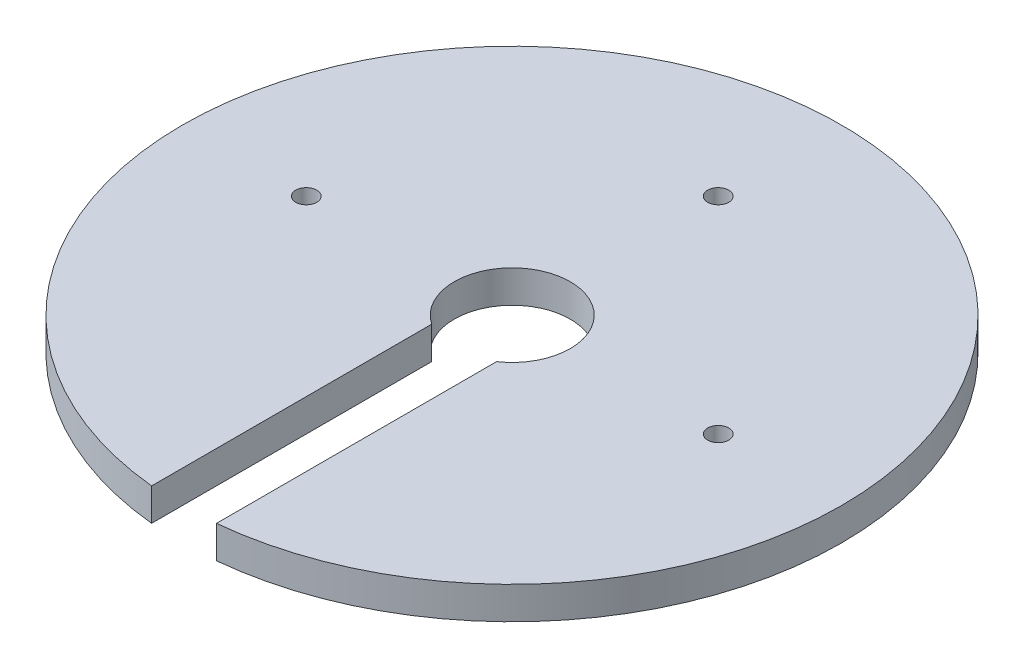
ISO-10303-21;
HEADER;
FILE_DESCRIPTION(('STEP AP214'),'2;1');
FILE_NAME('part.step','',(''),(''),'','','');
FILE_SCHEMA(('AUTOMOTIVE_DESIGN { 1 0 10303 214 1 1 1 1 }'));
ENDSEC;
DATA;
#1=APPLICATION_CONTEXT('core data for automotive mechanical design processes');
#2=APPLICATION_PROTOCOL_DEFINITION('international standard','automotive_design',2000,#1);
#3=PRODUCT_CONTEXT('',#1,'mechanical');
#4=PRODUCT('Part','Part','',(#3));
#5=PRODUCT_RELATED_PRODUCT_CATEGORY('part','',(#4));
#6=PRODUCT_DEFINITION_FORMATION('','',#4);
#7=PRODUCT_DEFINITION_CONTEXT('part definition',#1,'design');
#8=PRODUCT_DEFINITION('design','',#6,#7);
#9=PRODUCT_DEFINITION_SHAPE('','',#8);
#10=(LENGTH_UNIT() NAMED_UNIT(*) SI_UNIT(.MILLI.,.METRE.));
#11=(NAMED_UNIT(*) PLANE_ANGLE_UNIT() SI_UNIT($,.RADIAN.));
#12=(NAMED_UNIT(*) SI_UNIT($,.STERADIAN.) SOLID_ANGLE_UNIT());
#13=UNCERTAINTY_MEASURE_WITH_UNIT(LENGTH_MEASURE(1.E-05),#10,'distance_accuracy_value','');
#14=(GEOMETRIC_REPRESENTATION_CONTEXT(3) GLOBAL_UNCERTAINTY_ASSIGNED_CONTEXT((#13)) GLOBAL_UNIT_ASSIGNED_CONTEXT((#10,
#11,#12)) REPRESENTATION_CONTEXT('',''));
#15=CARTESIAN_POINT('',(0.,0.,0.));
#16=DIRECTION('',(0.,0.,1.));
#17=DIRECTION('',(1.,0.,0.));
#18=AXIS2_PLACEMENT_3D('',#15,#16,#17);
#19=CARTESIAN_POINT('',(0.,10.,0.));
#20=DIRECTION('',(0.,-1.,0.));
#21=DIRECTION('',(0.,0.,-1.));
#22=AXIS2_PLACEMENT_3D('',#19,#20,#21);
#23=CYLINDRICAL_SURFACE('',#22,101.6);
#24=CARTESIAN_POINT('',(0.,10.,0.));
#25=DIRECTION('',(0.,1.,0.));
#26=DIRECTION('',(0.,0.,1.));
#27=AXIS2_PLACEMENT_3D('',#24,#25,#26);
#28=CIRCLE('',#27,101.6);
#29=CARTESIAN_POINT('',(9.99999999999999,10.,101.106676337421));
#30=VERTEX_POINT('',#29);
#31=CARTESIAN_POINT('',(-9.99999999999999,10.,101.106676337421));
#32=VERTEX_POINT('',#31);
#33=EDGE_CURVE('E11',#30,#32,#28,.T.);
#34=ORIENTED_EDGE('',*,*,#33,.F.);
#35=DIRECTION('',(0.,1.,0.));
#36=VECTOR('',#35,1.);
#37=CARTESIAN_POINT('',(9.99999999999999,0.,101.106676337421));
#38=LINE('',#37,#36);
#39=CARTESIAN_POINT('',(9.99999999999999,0.,101.106676337421));
#40=VERTEX_POINT('',#39);
#41=EDGE_CURVE('E107',#40,#30,#38,.T.);
#42=ORIENTED_EDGE('',*,*,#41,.F.);
#43=CARTESIAN_POINT('',(0.,0.,0.));
#44=DIRECTION('',(0.,1.,0.));
#45=DIRECTION('',(0.,0.,1.));
#46=AXIS2_PLACEMENT_3D('',#43,#44,#45);
#47=CIRCLE('',#46,101.6);
#48=CARTESIAN_POINT('',(-9.99999999999999,0.,101.106676337421));
#49=VERTEX_POINT('',#48);
#50=EDGE_CURVE('E40',#40,#49,#47,.T.);
#51=ORIENTED_EDGE('',*,*,#50,.T.);
#52=DIRECTION('',(0.,1.,0.));
#53=VECTOR('',#52,1.);
#54=CARTESIAN_POINT('',(-9.99999999999999,0.,101.106676337421));
#55=LINE('',#54,#53);
#56=EDGE_CURVE('E51',#49,#32,#55,.T.);
#57=ORIENTED_EDGE('',*,*,#56,.T.);
#58=EDGE_LOOP('',(#34,#42,#51,#57));
#59=FACE_BOUND('',#58,.T.);
#60=ADVANCED_FACE('F37',(#59),#23,.T.);
#61=CARTESIAN_POINT('',(0.,10.,0.));
#62=DIRECTION('',(0.,1.,0.));
#63=DIRECTION('',(0.,0.,1.));
#64=AXIS2_PLACEMENT_3D('',#61,#62,#63);
#65=PLANE('',#64);
#66=CARTESIAN_POINT('',(0.,10.,-63.5707950450435));
#67=DIRECTION('',(0.,1.,0.));
#68=DIRECTION('',(0.,0.,1.));
#69=AXIS2_PLACEMENT_3D('',#66,#67,#68);
#70=CIRCLE('',#69,3.25);
#71=CARTESIAN_POINT('',(0.,10.,-60.3207950450435));
#72=VERTEX_POINT('',#71);
#73=EDGE_CURVE('E139',#72,#72,#70,.T.);
#74=ORIENTED_EDGE('',*,*,#73,.F.);
#75=EDGE_LOOP('',(#74));
#76=FACE_BOUND('',#75,.T.);
#77=CARTESIAN_POINT('',(-63.5,10.,-0.0707950450435403));
#78=DIRECTION('',(0.,1.,0.));
#79=DIRECTION('',(0.,0.,1.));
#80=AXIS2_PLACEMENT_3D('',#77,#78,#79);
#81=CIRCLE('',#80,3.25000000000001);
#82=CARTESIAN_POINT('',(-63.5,10.,3.17920495495647));
#83=VERTEX_POINT('',#82);
#84=EDGE_CURVE('E143',#83,#83,#81,.T.);
#85=ORIENTED_EDGE('',*,*,#84,.F.);
#86=EDGE_LOOP('',(#85));
#87=FACE_BOUND('',#86,.T.);
#88=CARTESIAN_POINT('',(63.5,10.,-0.0707950450435403));
#89=DIRECTION('',(0.,1.,0.));
#90=DIRECTION('',(0.,0.,1.));
#91=AXIS2_PLACEMENT_3D('',#88,#89,#90);
#92=CIRCLE('',#91,3.25000000000001);
#93=CARTESIAN_POINT('',(63.5,10.,3.17920495495647));
#94=VERTEX_POINT('',#93);
#95=EDGE_CURVE('E104',#94,#94,#92,.T.);
#96=ORIENTED_EDGE('',*,*,#95,.F.);
#97=EDGE_LOOP('',(#96));
#98=FACE_BOUND('',#97,.T.);
#99=DIRECTION('',(0.,0.,-1.));
#100=VECTOR('',#99,1.);
#101=CARTESIAN_POINT('',(10.,10.,14.746676337421));
#102=LINE('',#101,#100);
#103=CARTESIAN_POINT('',(10.,10.,14.746676337421));
#104=VERTEX_POINT('',#103);
#105=EDGE_CURVE('E94',#30,#104,#102,.T.);
#106=ORIENTED_EDGE('',*,*,#105,.F.);
#107=ORIENTED_EDGE('',*,*,#33,.T.);
#108=DIRECTION('',(0.,0.,1.));
#109=VECTOR('',#108,1.);
#110=CARTESIAN_POINT('',(-10.,10.,14.746676337421));
#111=LINE('',#110,#109);
#112=CARTESIAN_POINT('',(-10.,10.,14.746676337421));
#113=VERTEX_POINT('',#112);
#114=EDGE_CURVE('E96',#113,#32,#111,.T.);
#115=ORIENTED_EDGE('',*,*,#114,.F.);
#116=CARTESIAN_POINT('',(0.,10.,-0.0707950450435403));
#117=DIRECTION('',(0.,1.,0.));
#118=DIRECTION('',(0.,0.,-1.));
#119=AXIS2_PLACEMENT_3D('',#116,#117,#118);
#120=CIRCLE('',#119,17.8761701203069);
#121=EDGE_CURVE('E83',#104,#113,#120,.T.);
#122=ORIENTED_EDGE('',*,*,#121,.F.);
#123=EDGE_LOOP('',(#106,#107,#115,#122));
#124=FACE_BOUND('',#123,.T.);
#125=ADVANCED_FACE('F114',(#76,#87,#98,#124),#65,.T.);
#126=CARTESIAN_POINT('',(0.,0.,0.));
#127=DIRECTION('',(0.,1.,0.));
#128=DIRECTION('',(0.,0.,1.));
#129=AXIS2_PLACEMENT_3D('',#126,#127,#128);
#130=PLANE('',#129);
#131=CARTESIAN_POINT('',(0.,0.,-63.5707950450435));
#132=DIRECTION('',(0.,1.,0.));
#133=DIRECTION('',(0.,0.,1.));
#134=AXIS2_PLACEMENT_3D('',#131,#132,#133);
#135=CIRCLE('',#134,3.25);
#136=CARTESIAN_POINT('',(0.,0.,-60.3207950450435));
#137=VERTEX_POINT('',#136);
#138=EDGE_CURVE('E99',#137,#137,#135,.T.);
#139=ORIENTED_EDGE('',*,*,#138,.T.);
#140=EDGE_LOOP('',(#139));
#141=FACE_BOUND('',#140,.T.);
#142=CARTESIAN_POINT('',(-63.5,0.,-0.0707950450435403));
#143=DIRECTION('',(0.,1.,0.));
#144=DIRECTION('',(0.,0.,1.));
#145=AXIS2_PLACEMENT_3D('',#142,#143,#144);
#146=CIRCLE('',#145,3.25000000000001);
#147=CARTESIAN_POINT('',(-63.5,0.,3.17920495495647));
#148=VERTEX_POINT('',#147);
#149=EDGE_CURVE('E153',#148,#148,#146,.T.);
#150=ORIENTED_EDGE('',*,*,#149,.T.);
#151=EDGE_LOOP('',(#150));
#152=FACE_BOUND('',#151,.T.);
#153=CARTESIAN_POINT('',(63.5,0.,-0.0707950450435403));
#154=DIRECTION('',(0.,1.,0.));
#155=DIRECTION('',(0.,0.,1.));
#156=AXIS2_PLACEMENT_3D('',#153,#154,#155);
#157=CIRCLE('',#156,3.25000000000001);
#158=CARTESIAN_POINT('',(63.5,0.,3.17920495495647));
#159=VERTEX_POINT('',#158);
#160=EDGE_CURVE('E147',#159,#159,#157,.T.);
#161=ORIENTED_EDGE('',*,*,#160,.T.);
#162=EDGE_LOOP('',(#161));
#163=FACE_BOUND('',#162,.T.);
#164=ORIENTED_EDGE('',*,*,#50,.F.);
#165=DIRECTION('',(0.,0.,-1.));
#166=VECTOR('',#165,1.);
#167=CARTESIAN_POINT('',(10.,0.,14.746676337421));
#168=LINE('',#167,#166);
#169=CARTESIAN_POINT('',(10.,0.,14.746676337421));
#170=VERTEX_POINT('',#169);
#171=EDGE_CURVE('E85',#40,#170,#168,.T.);
#172=ORIENTED_EDGE('',*,*,#171,.T.);
#173=CARTESIAN_POINT('',(0.,0.,-0.0707950450435403));
#174=DIRECTION('',(0.,1.,0.));
#175=DIRECTION('',(0.,0.,-1.));
#176=AXIS2_PLACEMENT_3D('',#173,#174,#175);
#177=CIRCLE('',#176,17.8761701203069);
#178=CARTESIAN_POINT('',(-10.,0.,14.746676337421));
#179=VERTEX_POINT('',#178);
#180=EDGE_CURVE('E80',#170,#179,#177,.T.);
#181=ORIENTED_EDGE('',*,*,#180,.T.);
#182=DIRECTION('',(0.,0.,1.));
#183=VECTOR('',#182,1.);
#184=CARTESIAN_POINT('',(-10.,0.,14.746676337421));
#185=LINE('',#184,#183);
#186=EDGE_CURVE('E87',#179,#49,#185,.T.);
#187=ORIENTED_EDGE('',*,*,#186,.T.);
#188=EDGE_LOOP('',(#164,#172,#181,#187));
#189=FACE_BOUND('',#188,.T.);
#190=ADVANCED_FACE('F93',(#141,#152,#163,#189),#130,.F.);
#191=CARTESIAN_POINT('',(0.,0.,-0.0707950450435403));
#192=DIRECTION('',(0.,1.,0.));
#193=DIRECTION('',(0.,0.,1.));
#194=AXIS2_PLACEMENT_3D('',#191,#192,#193);
#195=CYLINDRICAL_SURFACE('',#194,17.8761701203069);
#196=ORIENTED_EDGE('',*,*,#121,.T.);
#197=DIRECTION('',(0.,1.,0.));
#198=VECTOR('',#197,1.);
#199=CARTESIAN_POINT('',(-10.,0.,14.746676337421));
#200=LINE('',#199,#198);
#201=EDGE_CURVE('E77',#179,#113,#200,.T.);
#202=ORIENTED_EDGE('',*,*,#201,.F.);
#203=ORIENTED_EDGE('',*,*,#180,.F.);
#204=DIRECTION('',(0.,1.,0.));
#205=VECTOR('',#204,1.);
#206=CARTESIAN_POINT('',(10.,0.,14.746676337421));
#207=LINE('',#206,#205);
#208=EDGE_CURVE('E60',#170,#104,#207,.T.);
#209=ORIENTED_EDGE('',*,*,#208,.T.);
#210=EDGE_LOOP('',(#196,#202,#203,#209));
#211=FACE_BOUND('',#210,.T.);
#212=ADVANCED_FACE('F78',(#211),#195,.F.);
#213=CARTESIAN_POINT('',(10.,0.,14.746676337421));
#214=DIRECTION('',(1.,0.,0.));
#215=DIRECTION('',(0.,0.,-1.));
#216=AXIS2_PLACEMENT_3D('',#213,#214,#215);
#217=PLANE('',#216);
#218=ORIENTED_EDGE('',*,*,#105,.T.);
#219=ORIENTED_EDGE('',*,*,#208,.F.);
#220=ORIENTED_EDGE('',*,*,#171,.F.);
#221=ORIENTED_EDGE('',*,*,#41,.T.);
#222=EDGE_LOOP('',(#218,#219,#220,#221));
#223=FACE_BOUND('',#222,.T.);
#224=ADVANCED_FACE('F115',(#223),#217,.F.);
#225=CARTESIAN_POINT('',(-10.,0.,14.746676337421));
#226=DIRECTION('',(-1.,0.,0.));
#227=DIRECTION('',(0.,0.,1.));
#228=AXIS2_PLACEMENT_3D('',#225,#226,#227);
#229=PLANE('',#228);
#230=ORIENTED_EDGE('',*,*,#114,.T.);
#231=ORIENTED_EDGE('',*,*,#56,.F.);
#232=ORIENTED_EDGE('',*,*,#186,.F.);
#233=ORIENTED_EDGE('',*,*,#201,.T.);
#234=EDGE_LOOP('',(#230,#231,#232,#233));
#235=FACE_BOUND('',#234,.T.);
#236=ADVANCED_FACE('F88',(#235),#229,.F.);
#237=CARTESIAN_POINT('',(63.5,0.,-0.0707950450435403));
#238=DIRECTION('',(0.,1.,0.));
#239=DIRECTION('',(0.,0.,1.));
#240=AXIS2_PLACEMENT_3D('',#237,#238,#239);
#241=CYLINDRICAL_SURFACE('',#240,3.25000000000001);
#242=ORIENTED_EDGE('',*,*,#160,.F.);
#243=EDGE_LOOP('',(#242));
#244=FACE_BOUND('',#243,.T.);
#245=ORIENTED_EDGE('',*,*,#95,.T.);
#246=EDGE_LOOP('',(#245));
#247=FACE_BOUND('',#246,.T.);
#248=ADVANCED_FACE('F122',(#244,#247),#241,.F.);
#249=CARTESIAN_POINT('',(-63.5,0.,-0.0707950450435403));
#250=DIRECTION('',(0.,1.,0.));
#251=DIRECTION('',(0.,0.,1.));
#252=AXIS2_PLACEMENT_3D('',#249,#250,#251);
#253=CYLINDRICAL_SURFACE('',#252,3.25000000000001);
#254=ORIENTED_EDGE('',*,*,#149,.F.);
#255=EDGE_LOOP('',(#254));
#256=FACE_BOUND('',#255,.T.);
#257=ORIENTED_EDGE('',*,*,#84,.T.);
#258=EDGE_LOOP('',(#257));
#259=FACE_BOUND('',#258,.T.);
#260=ADVANCED_FACE('F162',(#256,#259),#253,.F.);
#261=CARTESIAN_POINT('',(0.,0.,-63.5707950450435));
#262=DIRECTION('',(0.,1.,0.));
#263=DIRECTION('',(0.,0.,1.));
#264=AXIS2_PLACEMENT_3D('',#261,#262,#263);
#265=CYLINDRICAL_SURFACE('',#264,3.25);
#266=ORIENTED_EDGE('',*,*,#138,.F.);
#267=EDGE_LOOP('',(#266));
#268=FACE_BOUND('',#267,.T.);
#269=ORIENTED_EDGE('',*,*,#73,.T.);
#270=EDGE_LOOP('',(#269));
#271=FACE_BOUND('',#270,.T.);
#272=ADVANCED_FACE('F160',(#268,#271),#265,.F.);
#273=CLOSED_SHELL('',(#60,#125,#190,#212,#224,#236,#248,#260,#272));
#274=MANIFOLD_SOLID_BREP('B2',#273);
#275=ADVANCED_BREP_SHAPE_REPRESENTATION('',(#18,#274),#14);
#276=SHAPE_DEFINITION_REPRESENTATION(#9,#275);
ENDSEC;
END-ISO-10303-21;
